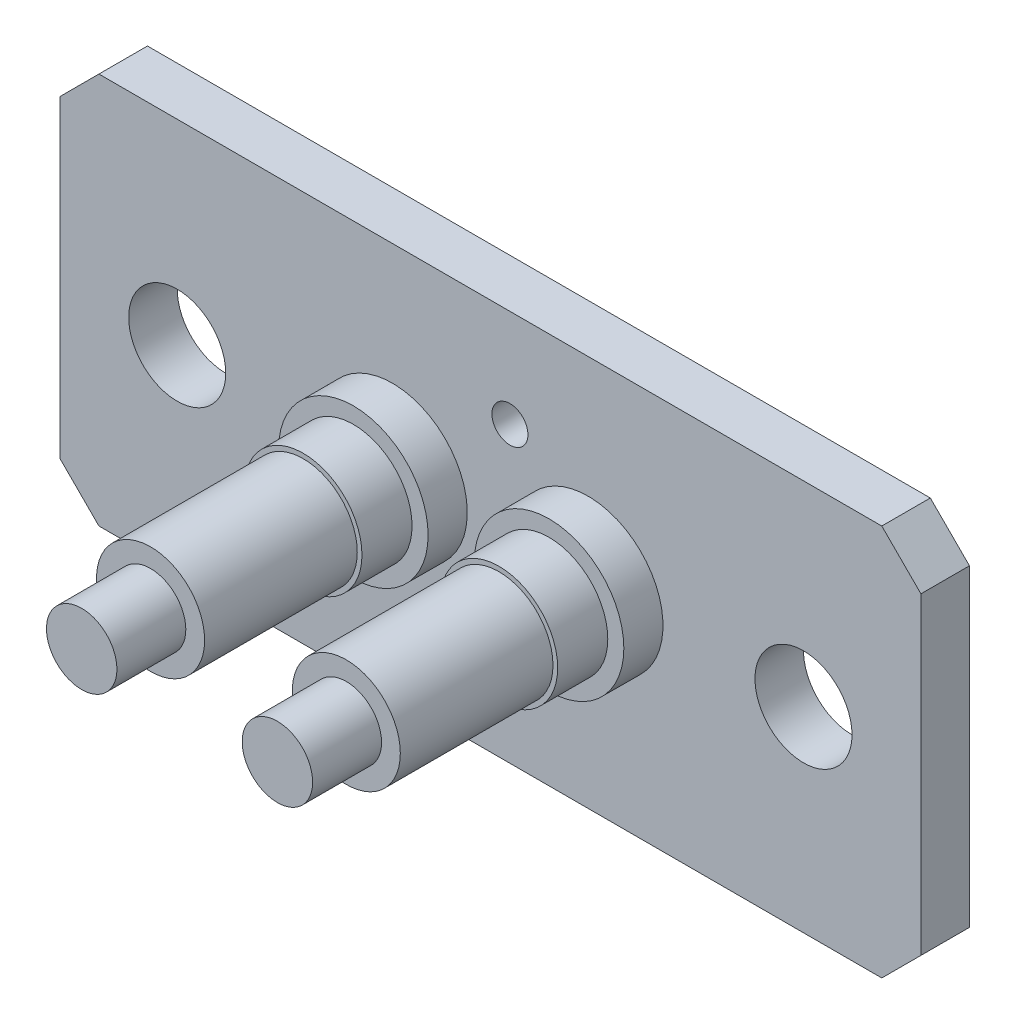
ISO-10303-21;
HEADER;
FILE_DESCRIPTION(('STEP AP214'),'2;1');
FILE_NAME('part.step','',(''),(''),'','','');
FILE_SCHEMA(('AUTOMOTIVE_DESIGN { 1 0 10303 214 1 1 1 1 }'));
ENDSEC;
DATA;
#1=APPLICATION_CONTEXT('core data for automotive mechanical design processes');
#2=APPLICATION_PROTOCOL_DEFINITION('international standard','automotive_design',2000,#1);
#3=PRODUCT_CONTEXT('',#1,'mechanical');
#4=PRODUCT('Part','Part','',(#3));
#5=PRODUCT_RELATED_PRODUCT_CATEGORY('part','',(#4));
#6=PRODUCT_DEFINITION_FORMATION('','',#4);
#7=PRODUCT_DEFINITION_CONTEXT('part definition',#1,'design');
#8=PRODUCT_DEFINITION('design','',#6,#7);
#9=PRODUCT_DEFINITION_SHAPE('','',#8);
#10=(LENGTH_UNIT() NAMED_UNIT(*) SI_UNIT(.MILLI.,.METRE.));
#11=(NAMED_UNIT(*) PLANE_ANGLE_UNIT() SI_UNIT($,.RADIAN.));
#12=(NAMED_UNIT(*) SI_UNIT($,.STERADIAN.) SOLID_ANGLE_UNIT());
#13=UNCERTAINTY_MEASURE_WITH_UNIT(LENGTH_MEASURE(1.E-05),#10,'distance_accuracy_value','');
#14=(GEOMETRIC_REPRESENTATION_CONTEXT(3) GLOBAL_UNCERTAINTY_ASSIGNED_CONTEXT((#13)) GLOBAL_UNIT_ASSIGNED_CONTEXT((#10,
#11,#12)) REPRESENTATION_CONTEXT('',''));
#15=CARTESIAN_POINT('',(0.,0.,0.));
#16=DIRECTION('',(0.,0.,1.));
#17=DIRECTION('',(1.,0.,0.));
#18=AXIS2_PLACEMENT_3D('',#15,#16,#17);
#19=CARTESIAN_POINT('',(0.,0.,1.5748));
#20=DIRECTION('',(0.,0.,-1.));
#21=DIRECTION('',(-1.,0.,0.));
#22=AXIS2_PLACEMENT_3D('',#19,#20,#21);
#23=PLANE('',#22);
#24=CARTESIAN_POINT('',(17.145,6.35,1.5748));
#25=DIRECTION('',(0.,0.,-1.));
#26=DIRECTION('',(-1.,0.,0.));
#27=AXIS2_PLACEMENT_3D('',#24,#25,#26);
#28=CIRCLE('',#27,2.4257);
#29=CARTESIAN_POINT('',(14.7193,6.35,1.5748));
#30=VERTEX_POINT('',#29);
#31=EDGE_CURVE('E163',#30,#30,#28,.F.);
#32=ORIENTED_EDGE('',*,*,#31,.F.);
#33=EDGE_LOOP('',(#32));
#34=FACE_BOUND('',#33,.T.);
#35=CARTESIAN_POINT('',(10.795,6.35,1.5748));
#36=DIRECTION('',(0.,0.,-1.));
#37=DIRECTION('',(-1.,0.,0.));
#38=AXIS2_PLACEMENT_3D('',#35,#36,#37);
#39=CIRCLE('',#38,2.4257);
#40=CARTESIAN_POINT('',(8.3693,6.35,1.5748));
#41=VERTEX_POINT('',#40);
#42=EDGE_CURVE('E160',#41,#41,#39,.F.);
#43=ORIENTED_EDGE('',*,*,#42,.F.);
#44=EDGE_LOOP('',(#43));
#45=FACE_BOUND('',#44,.T.);
#46=DIRECTION('',(0.,-1.,0.));
#47=VECTOR('',#46,1.);
#48=CARTESIAN_POINT('',(0.,1.27,1.5748));
#49=LINE('',#48,#47);
#50=CARTESIAN_POINT('',(0.,11.43,1.5748));
#51=VERTEX_POINT('',#50);
#52=CARTESIAN_POINT('',(0.,1.27,1.5748));
#53=VERTEX_POINT('',#52);
#54=EDGE_CURVE('E145',#51,#53,#49,.T.);
#55=ORIENTED_EDGE('',*,*,#54,.T.);
#56=DIRECTION('',(0.707106781186548,-0.707106781186548,0.));
#57=VECTOR('',#56,1.);
#58=CARTESIAN_POINT('',(1.27,0.,1.5748));
#59=LINE('',#58,#57);
#60=CARTESIAN_POINT('',(1.27,0.,1.5748));
#61=VERTEX_POINT('',#60);
#62=EDGE_CURVE('E93',#53,#61,#59,.T.);
#63=ORIENTED_EDGE('',*,*,#62,.T.);
#64=DIRECTION('',(1.,0.,0.));
#65=VECTOR('',#64,1.);
#66=CARTESIAN_POINT('',(26.67,0.,1.5748));
#67=LINE('',#66,#65);
#68=CARTESIAN_POINT('',(26.67,0.,1.5748));
#69=VERTEX_POINT('',#68);
#70=EDGE_CURVE('E247',#61,#69,#67,.T.);
#71=ORIENTED_EDGE('',*,*,#70,.T.);
#72=DIRECTION('',(0.707106781186548,0.707106781186547,0.));
#73=VECTOR('',#72,1.);
#74=CARTESIAN_POINT('',(27.94,1.27,1.5748));
#75=LINE('',#74,#73);
#76=CARTESIAN_POINT('',(27.94,1.27,1.5748));
#77=VERTEX_POINT('',#76);
#78=EDGE_CURVE('E249',#69,#77,#75,.T.);
#79=ORIENTED_EDGE('',*,*,#78,.T.);
#80=DIRECTION('',(0.,1.,0.));
#81=VECTOR('',#80,1.);
#82=CARTESIAN_POINT('',(27.94,11.43,1.5748));
#83=LINE('',#82,#81);
#84=CARTESIAN_POINT('',(27.94,11.43,1.5748));
#85=VERTEX_POINT('',#84);
#86=EDGE_CURVE('E112',#77,#85,#83,.T.);
#87=ORIENTED_EDGE('',*,*,#86,.T.);
#88=DIRECTION('',(-0.707106781186547,0.707106781186548,0.));
#89=VECTOR('',#88,1.);
#90=CARTESIAN_POINT('',(26.67,12.7,1.5748));
#91=LINE('',#90,#89);
#92=CARTESIAN_POINT('',(26.67,12.7,1.5748));
#93=VERTEX_POINT('',#92);
#94=EDGE_CURVE('E106',#85,#93,#91,.T.);
#95=ORIENTED_EDGE('',*,*,#94,.T.);
#96=DIRECTION('',(-1.,0.,0.));
#97=VECTOR('',#96,1.);
#98=CARTESIAN_POINT('',(1.27,12.7,1.5748));
#99=LINE('',#98,#97);
#100=CARTESIAN_POINT('',(1.27,12.7,1.5748));
#101=VERTEX_POINT('',#100);
#102=EDGE_CURVE('E110',#93,#101,#99,.T.);
#103=ORIENTED_EDGE('',*,*,#102,.T.);
#104=DIRECTION('',(-0.707106781186547,-0.707106781186548,0.));
#105=VECTOR('',#104,1.);
#106=CARTESIAN_POINT('',(0.,11.43,1.5748));
#107=LINE('',#106,#105);
#108=EDGE_CURVE('E49',#101,#51,#107,.T.);
#109=ORIENTED_EDGE('',*,*,#108,.T.);
#110=EDGE_LOOP('',(#55,#63,#71,#79,#87,#95,#103,#109));
#111=FACE_BOUND('',#110,.T.);
#112=CARTESIAN_POINT('',(3.81,6.35,1.5748));
#113=DIRECTION('',(0.,0.,1.));
#114=DIRECTION('',(1.,0.,0.));
#115=AXIS2_PLACEMENT_3D('',#112,#113,#114);
#116=CIRCLE('',#115,1.5748);
#117=CARTESIAN_POINT('',(5.3848,6.35,1.5748));
#118=VERTEX_POINT('',#117);
#119=EDGE_CURVE('E235',#118,#118,#116,.T.);
#120=ORIENTED_EDGE('',*,*,#119,.F.);
#121=EDGE_LOOP('',(#120));
#122=FACE_BOUND('',#121,.T.);
#123=CARTESIAN_POINT('',(24.13,6.35,1.5748));
#124=DIRECTION('',(0.,0.,1.));
#125=DIRECTION('',(1.,0.,0.));
#126=AXIS2_PLACEMENT_3D('',#123,#124,#125);
#127=CIRCLE('',#126,1.5748);
#128=CARTESIAN_POINT('',(25.7048,6.35,1.5748));
#129=VERTEX_POINT('',#128);
#130=EDGE_CURVE('E229',#129,#129,#127,.T.);
#131=ORIENTED_EDGE('',*,*,#130,.F.);
#132=EDGE_LOOP('',(#131));
#133=FACE_BOUND('',#132,.T.);
#134=CARTESIAN_POINT('',(13.335,3.175,1.5748));
#135=DIRECTION('',(0.,0.,1.));
#136=DIRECTION('',(1.,0.,0.));
#137=AXIS2_PLACEMENT_3D('',#134,#135,#136);
#138=CIRCLE('',#137,0.5842);
#139=CARTESIAN_POINT('',(13.9192,3.175,1.5748));
#140=VERTEX_POINT('',#139);
#141=EDGE_CURVE('E223',#140,#140,#138,.T.);
#142=ORIENTED_EDGE('',*,*,#141,.F.);
#143=EDGE_LOOP('',(#142));
#144=FACE_BOUND('',#143,.T.);
#145=CARTESIAN_POINT('',(14.605,9.525,1.5748));
#146=DIRECTION('',(0.,0.,1.));
#147=DIRECTION('',(1.,0.,0.));
#148=AXIS2_PLACEMENT_3D('',#145,#146,#147);
#149=CIRCLE('',#148,0.5842);
#150=CARTESIAN_POINT('',(15.1892,9.525,1.5748));
#151=VERTEX_POINT('',#150);
#152=EDGE_CURVE('E217',#151,#151,#149,.T.);
#153=ORIENTED_EDGE('',*,*,#152,.F.);
#154=EDGE_LOOP('',(#153));
#155=FACE_BOUND('',#154,.T.);
#156=ADVANCED_FACE('F32',(#34,#45,#111,#122,#133,#144,#155),#23,.F.);
#157=CARTESIAN_POINT('',(0.,0.,0.));
#158=DIRECTION('',(0.,0.,-1.));
#159=DIRECTION('',(-1.,0.,0.));
#160=AXIS2_PLACEMENT_3D('',#157,#158,#159);
#161=PLANE('',#160);
#162=CARTESIAN_POINT('',(13.335,3.175,0.));
#163=DIRECTION('',(0.,0.,1.));
#164=DIRECTION('',(1.,0.,0.));
#165=AXIS2_PLACEMENT_3D('',#162,#163,#164);
#166=CIRCLE('',#165,0.5842);
#167=CARTESIAN_POINT('',(13.9192,3.175,0.));
#168=VERTEX_POINT('',#167);
#169=EDGE_CURVE('E220',#168,#168,#166,.T.);
#170=ORIENTED_EDGE('',*,*,#169,.T.);
#171=EDGE_LOOP('',(#170));
#172=FACE_BOUND('',#171,.T.);
#173=CARTESIAN_POINT('',(3.81,6.35,0.));
#174=DIRECTION('',(0.,0.,1.));
#175=DIRECTION('',(1.,0.,0.));
#176=AXIS2_PLACEMENT_3D('',#173,#174,#175);
#177=CIRCLE('',#176,1.5748);
#178=CARTESIAN_POINT('',(5.3848,6.35,0.));
#179=VERTEX_POINT('',#178);
#180=EDGE_CURVE('E232',#179,#179,#177,.T.);
#181=ORIENTED_EDGE('',*,*,#180,.T.);
#182=EDGE_LOOP('',(#181));
#183=FACE_BOUND('',#182,.T.);
#184=CARTESIAN_POINT('',(10.795,6.35,0.));
#185=DIRECTION('',(0.,0.,1.));
#186=DIRECTION('',(1.,0.,0.));
#187=AXIS2_PLACEMENT_3D('',#184,#185,#186);
#188=CIRCLE('',#187,0.5842);
#189=CARTESIAN_POINT('',(11.3792,6.35,0.));
#190=VERTEX_POINT('',#189);
#191=EDGE_CURVE('E134',#190,#190,#188,.T.);
#192=ORIENTED_EDGE('',*,*,#191,.T.);
#193=EDGE_LOOP('',(#192));
#194=FACE_BOUND('',#193,.T.);
#195=DIRECTION('',(0.,-1.,0.));
#196=VECTOR('',#195,1.);
#197=CARTESIAN_POINT('',(0.,1.27,0.));
#198=LINE('',#197,#196);
#199=CARTESIAN_POINT('',(0.,11.43,0.));
#200=VERTEX_POINT('',#199);
#201=CARTESIAN_POINT('',(0.,1.27,0.));
#202=VERTEX_POINT('',#201);
#203=EDGE_CURVE('E130',#200,#202,#198,.T.);
#204=ORIENTED_EDGE('',*,*,#203,.F.);
#205=DIRECTION('',(-0.707106781186547,-0.707106781186548,0.));
#206=VECTOR('',#205,1.);
#207=CARTESIAN_POINT('',(0.,11.43,0.));
#208=LINE('',#207,#206);
#209=CARTESIAN_POINT('',(1.27,12.7,0.));
#210=VERTEX_POINT('',#209);
#211=EDGE_CURVE('E84',#210,#200,#208,.T.);
#212=ORIENTED_EDGE('',*,*,#211,.F.);
#213=DIRECTION('',(-1.,0.,0.));
#214=VECTOR('',#213,1.);
#215=CARTESIAN_POINT('',(1.27,12.7,0.));
#216=LINE('',#215,#214);
#217=CARTESIAN_POINT('',(26.67,12.7,0.));
#218=VERTEX_POINT('',#217);
#219=EDGE_CURVE('E78',#218,#210,#216,.T.);
#220=ORIENTED_EDGE('',*,*,#219,.F.);
#221=DIRECTION('',(-0.707106781186547,0.707106781186548,0.));
#222=VECTOR('',#221,1.);
#223=CARTESIAN_POINT('',(26.67,12.7,0.));
#224=LINE('',#223,#222);
#225=CARTESIAN_POINT('',(27.94,11.43,0.));
#226=VERTEX_POINT('',#225);
#227=EDGE_CURVE('E120',#226,#218,#224,.T.);
#228=ORIENTED_EDGE('',*,*,#227,.F.);
#229=DIRECTION('',(0.,1.,0.));
#230=VECTOR('',#229,1.);
#231=CARTESIAN_POINT('',(27.94,11.43,0.));
#232=LINE('',#231,#230);
#233=CARTESIAN_POINT('',(27.94,1.27,0.));
#234=VERTEX_POINT('',#233);
#235=EDGE_CURVE('E140',#234,#226,#232,.T.);
#236=ORIENTED_EDGE('',*,*,#235,.F.);
#237=DIRECTION('',(0.707106781186548,0.707106781186547,0.));
#238=VECTOR('',#237,1.);
#239=CARTESIAN_POINT('',(27.94,1.27,0.));
#240=LINE('',#239,#238);
#241=CARTESIAN_POINT('',(26.67,0.,0.));
#242=VERTEX_POINT('',#241);
#243=EDGE_CURVE('E138',#242,#234,#240,.T.);
#244=ORIENTED_EDGE('',*,*,#243,.F.);
#245=DIRECTION('',(1.,0.,0.));
#246=VECTOR('',#245,1.);
#247=CARTESIAN_POINT('',(26.67,0.,0.));
#248=LINE('',#247,#246);
#249=CARTESIAN_POINT('',(1.27,0.,0.));
#250=VERTEX_POINT('',#249);
#251=EDGE_CURVE('E136',#250,#242,#248,.T.);
#252=ORIENTED_EDGE('',*,*,#251,.F.);
#253=DIRECTION('',(0.707106781186548,-0.707106781186548,0.));
#254=VECTOR('',#253,1.);
#255=CARTESIAN_POINT('',(1.27,0.,0.));
#256=LINE('',#255,#254);
#257=EDGE_CURVE('E133',#202,#250,#256,.T.);
#258=ORIENTED_EDGE('',*,*,#257,.F.);
#259=EDGE_LOOP('',(#204,#212,#220,#228,#236,#244,#252,#258));
#260=FACE_BOUND('',#259,.T.);
#261=CARTESIAN_POINT('',(17.145,6.35,0.));
#262=DIRECTION('',(0.,0.,1.));
#263=DIRECTION('',(1.,0.,0.));
#264=AXIS2_PLACEMENT_3D('',#261,#262,#263);
#265=CIRCLE('',#264,0.5842);
#266=CARTESIAN_POINT('',(17.7292,6.35,0.));
#267=VERTEX_POINT('',#266);
#268=EDGE_CURVE('E238',#267,#267,#265,.T.);
#269=ORIENTED_EDGE('',*,*,#268,.T.);
#270=EDGE_LOOP('',(#269));
#271=FACE_BOUND('',#270,.T.);
#272=CARTESIAN_POINT('',(24.13,6.35,0.));
#273=DIRECTION('',(0.,0.,1.));
#274=DIRECTION('',(1.,0.,0.));
#275=AXIS2_PLACEMENT_3D('',#272,#273,#274);
#276=CIRCLE('',#275,1.5748);
#277=CARTESIAN_POINT('',(25.7048,6.35,0.));
#278=VERTEX_POINT('',#277);
#279=EDGE_CURVE('E226',#278,#278,#276,.T.);
#280=ORIENTED_EDGE('',*,*,#279,.T.);
#281=EDGE_LOOP('',(#280));
#282=FACE_BOUND('',#281,.T.);
#283=CARTESIAN_POINT('',(14.605,9.525,0.));
#284=DIRECTION('',(0.,0.,1.));
#285=DIRECTION('',(1.,0.,0.));
#286=AXIS2_PLACEMENT_3D('',#283,#284,#285);
#287=CIRCLE('',#286,0.5842);
#288=CARTESIAN_POINT('',(15.1892,9.525,0.));
#289=VERTEX_POINT('',#288);
#290=EDGE_CURVE('E216',#289,#289,#287,.T.);
#291=ORIENTED_EDGE('',*,*,#290,.T.);
#292=EDGE_LOOP('',(#291));
#293=FACE_BOUND('',#292,.T.);
#294=ADVANCED_FACE('F262',(#172,#183,#194,#260,#271,#282,#293),#161,.T.);
#295=CARTESIAN_POINT('',(0.,1.27,1.5748));
#296=DIRECTION('',(1.,0.,0.));
#297=DIRECTION('',(0.,0.,-1.));
#298=AXIS2_PLACEMENT_3D('',#295,#296,#297);
#299=PLANE('',#298);
#300=ORIENTED_EDGE('',*,*,#203,.T.);
#301=DIRECTION('',(0.,0.,-1.));
#302=VECTOR('',#301,1.);
#303=CARTESIAN_POINT('',(0.,1.27,1.5748));
#304=LINE('',#303,#302);
#305=EDGE_CURVE('E158',#53,#202,#304,.T.);
#306=ORIENTED_EDGE('',*,*,#305,.F.);
#307=ORIENTED_EDGE('',*,*,#54,.F.);
#308=DIRECTION('',(0.,0.,-1.));
#309=VECTOR('',#308,1.);
#310=CARTESIAN_POINT('',(0.,11.43,1.5748));
#311=LINE('',#310,#309);
#312=EDGE_CURVE('E126',#51,#200,#311,.T.);
#313=ORIENTED_EDGE('',*,*,#312,.T.);
#314=EDGE_LOOP('',(#300,#306,#307,#313));
#315=FACE_BOUND('',#314,.T.);
#316=ADVANCED_FACE('F34',(#315),#299,.F.);
#317=CARTESIAN_POINT('',(1.27,0.,1.5748));
#318=DIRECTION('',(0.707106781186548,0.707106781186548,0.));
#319=DIRECTION('',(-0.707106781186548,0.707106781186548,0.));
#320=AXIS2_PLACEMENT_3D('',#317,#318,#319);
#321=PLANE('',#320);
#322=ORIENTED_EDGE('',*,*,#257,.T.);
#323=DIRECTION('',(0.,0.,-1.));
#324=VECTOR('',#323,1.);
#325=CARTESIAN_POINT('',(1.27,0.,1.5748));
#326=LINE('',#325,#324);
#327=EDGE_CURVE('E155',#61,#250,#326,.T.);
#328=ORIENTED_EDGE('',*,*,#327,.F.);
#329=ORIENTED_EDGE('',*,*,#62,.F.);
#330=ORIENTED_EDGE('',*,*,#305,.T.);
#331=EDGE_LOOP('',(#322,#328,#329,#330));
#332=FACE_BOUND('',#331,.T.);
#333=ADVANCED_FACE('F585',(#332),#321,.F.);
#334=CARTESIAN_POINT('',(26.67,0.,1.5748));
#335=DIRECTION('',(0.,1.,0.));
#336=DIRECTION('',(0.,0.,1.));
#337=AXIS2_PLACEMENT_3D('',#334,#335,#336);
#338=PLANE('',#337);
#339=ORIENTED_EDGE('',*,*,#251,.T.);
#340=DIRECTION('',(0.,0.,-1.));
#341=VECTOR('',#340,1.);
#342=CARTESIAN_POINT('',(26.67,0.,1.5748));
#343=LINE('',#342,#341);
#344=EDGE_CURVE('E152',#69,#242,#343,.T.);
#345=ORIENTED_EDGE('',*,*,#344,.F.);
#346=ORIENTED_EDGE('',*,*,#70,.F.);
#347=ORIENTED_EDGE('',*,*,#327,.T.);
#348=EDGE_LOOP('',(#339,#345,#346,#347));
#349=FACE_BOUND('',#348,.T.);
#350=ADVANCED_FACE('F576',(#349),#338,.F.);
#351=CARTESIAN_POINT('',(27.94,1.27,1.5748));
#352=DIRECTION('',(-0.707106781186548,0.707106781186548,0.));
#353=DIRECTION('',(-0.707106781186548,-0.707106781186548,0.));
#354=AXIS2_PLACEMENT_3D('',#351,#352,#353);
#355=PLANE('',#354);
#356=ORIENTED_EDGE('',*,*,#243,.T.);
#357=DIRECTION('',(0.,0.,-1.));
#358=VECTOR('',#357,1.);
#359=CARTESIAN_POINT('',(27.94,1.27,1.5748));
#360=LINE('',#359,#358);
#361=EDGE_CURVE('E149',#77,#234,#360,.T.);
#362=ORIENTED_EDGE('',*,*,#361,.F.);
#363=ORIENTED_EDGE('',*,*,#78,.F.);
#364=ORIENTED_EDGE('',*,*,#344,.T.);
#365=EDGE_LOOP('',(#356,#362,#363,#364));
#366=FACE_BOUND('',#365,.T.);
#367=ADVANCED_FACE('F255',(#366),#355,.F.);
#368=CARTESIAN_POINT('',(27.94,11.43,1.5748));
#369=DIRECTION('',(-1.,0.,0.));
#370=DIRECTION('',(0.,0.,1.));
#371=AXIS2_PLACEMENT_3D('',#368,#369,#370);
#372=PLANE('',#371);
#373=ORIENTED_EDGE('',*,*,#235,.T.);
#374=DIRECTION('',(0.,0.,-1.));
#375=VECTOR('',#374,1.);
#376=CARTESIAN_POINT('',(27.94,11.43,1.5748));
#377=LINE('',#376,#375);
#378=EDGE_CURVE('E121',#85,#226,#377,.T.);
#379=ORIENTED_EDGE('',*,*,#378,.F.);
#380=ORIENTED_EDGE('',*,*,#86,.F.);
#381=ORIENTED_EDGE('',*,*,#361,.T.);
#382=EDGE_LOOP('',(#373,#379,#380,#381));
#383=FACE_BOUND('',#382,.T.);
#384=ADVANCED_FACE('F259',(#383),#372,.F.);
#385=CARTESIAN_POINT('',(26.67,12.7,1.5748));
#386=DIRECTION('',(-0.707106781186548,-0.707106781186547,0.));
#387=DIRECTION('',(0.707106781186547,-0.707106781186548,0.));
#388=AXIS2_PLACEMENT_3D('',#385,#386,#387);
#389=PLANE('',#388);
#390=ORIENTED_EDGE('',*,*,#227,.T.);
#391=DIRECTION('',(0.,0.,-1.));
#392=VECTOR('',#391,1.);
#393=CARTESIAN_POINT('',(26.67,12.7,1.5748));
#394=LINE('',#393,#392);
#395=EDGE_CURVE('E117',#93,#218,#394,.T.);
#396=ORIENTED_EDGE('',*,*,#395,.F.);
#397=ORIENTED_EDGE('',*,*,#94,.F.);
#398=ORIENTED_EDGE('',*,*,#378,.T.);
#399=EDGE_LOOP('',(#390,#396,#397,#398));
#400=FACE_BOUND('',#399,.T.);
#401=ADVANCED_FACE('F118',(#400),#389,.F.);
#402=CARTESIAN_POINT('',(1.27,12.7,1.5748));
#403=DIRECTION('',(0.,-1.,0.));
#404=DIRECTION('',(0.,0.,-1.));
#405=AXIS2_PLACEMENT_3D('',#402,#403,#404);
#406=PLANE('',#405);
#407=ORIENTED_EDGE('',*,*,#219,.T.);
#408=DIRECTION('',(0.,0.,-1.));
#409=VECTOR('',#408,1.);
#410=CARTESIAN_POINT('',(1.27,12.7,1.5748));
#411=LINE('',#410,#409);
#412=EDGE_CURVE('E122',#101,#210,#411,.T.);
#413=ORIENTED_EDGE('',*,*,#412,.F.);
#414=ORIENTED_EDGE('',*,*,#102,.F.);
#415=ORIENTED_EDGE('',*,*,#395,.T.);
#416=EDGE_LOOP('',(#407,#413,#414,#415));
#417=FACE_BOUND('',#416,.T.);
#418=ADVANCED_FACE('F124',(#417),#406,.F.);
#419=CARTESIAN_POINT('',(0.,11.43,1.5748));
#420=DIRECTION('',(0.707106781186548,-0.707106781186547,0.));
#421=DIRECTION('',(0.707106781186547,0.707106781186548,0.));
#422=AXIS2_PLACEMENT_3D('',#419,#420,#421);
#423=PLANE('',#422);
#424=ORIENTED_EDGE('',*,*,#211,.T.);
#425=ORIENTED_EDGE('',*,*,#312,.F.);
#426=ORIENTED_EDGE('',*,*,#108,.F.);
#427=ORIENTED_EDGE('',*,*,#412,.T.);
#428=EDGE_LOOP('',(#424,#425,#426,#427));
#429=FACE_BOUND('',#428,.T.);
#430=ADVANCED_FACE('F268',(#429),#423,.F.);
#431=CARTESIAN_POINT('',(10.795,6.35,1.5748));
#432=DIRECTION('',(0.,0.,-1.));
#433=DIRECTION('',(-1.,0.,0.));
#434=AXIS2_PLACEMENT_3D('',#431,#432,#433);
#435=CYLINDRICAL_SURFACE('',#434,0.5842);
#436=CARTESIAN_POINT('',(10.795,6.35,1.5748));
#437=DIRECTION('',(0.,0.,1.));
#438=DIRECTION('',(1.,0.,0.));
#439=AXIS2_PLACEMENT_3D('',#436,#437,#438);
#440=CIRCLE('',#439,0.5842);
#441=CARTESIAN_POINT('',(11.3792,6.35,1.5748));
#442=VERTEX_POINT('',#441);
#443=EDGE_CURVE('E208',#442,#442,#440,.T.);
#444=ORIENTED_EDGE('',*,*,#443,.T.);
#445=EDGE_LOOP('',(#444));
#446=FACE_BOUND('',#445,.T.);
#447=ORIENTED_EDGE('',*,*,#191,.F.);
#448=EDGE_LOOP('',(#447));
#449=FACE_BOUND('',#448,.T.);
#450=ADVANCED_FACE('F270',(#446,#449),#435,.F.);
#451=CARTESIAN_POINT('',(17.145,6.35,1.5748));
#452=DIRECTION('',(0.,0.,-1.));
#453=DIRECTION('',(-1.,0.,0.));
#454=AXIS2_PLACEMENT_3D('',#451,#452,#453);
#455=CYLINDRICAL_SURFACE('',#454,0.5842);
#456=CARTESIAN_POINT('',(17.145,6.35,1.5748));
#457=DIRECTION('',(0.,0.,1.));
#458=DIRECTION('',(1.,0.,0.));
#459=AXIS2_PLACEMENT_3D('',#456,#457,#458);
#460=CIRCLE('',#459,0.5842);
#461=CARTESIAN_POINT('',(17.7292,6.35,1.5748));
#462=VERTEX_POINT('',#461);
#463=EDGE_CURVE('E203',#462,#462,#460,.T.);
#464=ORIENTED_EDGE('',*,*,#463,.T.);
#465=EDGE_LOOP('',(#464));
#466=FACE_BOUND('',#465,.T.);
#467=ORIENTED_EDGE('',*,*,#268,.F.);
#468=EDGE_LOOP('',(#467));
#469=FACE_BOUND('',#468,.T.);
#470=ADVANCED_FACE('F276',(#466,#469),#455,.F.);
#471=CARTESIAN_POINT('',(3.81,6.35,1.5748));
#472=DIRECTION('',(0.,0.,-1.));
#473=DIRECTION('',(-1.,0.,0.));
#474=AXIS2_PLACEMENT_3D('',#471,#472,#473);
#475=CYLINDRICAL_SURFACE('',#474,1.5748);
#476=ORIENTED_EDGE('',*,*,#119,.T.);
#477=EDGE_LOOP('',(#476));
#478=FACE_BOUND('',#477,.T.);
#479=ORIENTED_EDGE('',*,*,#180,.F.);
#480=EDGE_LOOP('',(#479));
#481=FACE_BOUND('',#480,.T.);
#482=ADVANCED_FACE('F293',(#478,#481),#475,.F.);
#483=CARTESIAN_POINT('',(24.13,6.35,1.5748));
#484=DIRECTION('',(0.,0.,-1.));
#485=DIRECTION('',(-1.,0.,0.));
#486=AXIS2_PLACEMENT_3D('',#483,#484,#485);
#487=CYLINDRICAL_SURFACE('',#486,1.5748);
#488=ORIENTED_EDGE('',*,*,#130,.T.);
#489=EDGE_LOOP('',(#488));
#490=FACE_BOUND('',#489,.T.);
#491=ORIENTED_EDGE('',*,*,#279,.F.);
#492=EDGE_LOOP('',(#491));
#493=FACE_BOUND('',#492,.T.);
#494=ADVANCED_FACE('F296',(#490,#493),#487,.F.);
#495=CARTESIAN_POINT('',(13.335,3.175,1.5748));
#496=DIRECTION('',(0.,0.,-1.));
#497=DIRECTION('',(-1.,0.,0.));
#498=AXIS2_PLACEMENT_3D('',#495,#496,#497);
#499=CYLINDRICAL_SURFACE('',#498,0.5842);
#500=ORIENTED_EDGE('',*,*,#141,.T.);
#501=EDGE_LOOP('',(#500));
#502=FACE_BOUND('',#501,.T.);
#503=ORIENTED_EDGE('',*,*,#169,.F.);
#504=EDGE_LOOP('',(#503));
#505=FACE_BOUND('',#504,.T.);
#506=ADVANCED_FACE('F300',(#502,#505),#499,.F.);
#507=CARTESIAN_POINT('',(14.605,9.525,1.5748));
#508=DIRECTION('',(0.,0.,-1.));
#509=DIRECTION('',(-1.,0.,0.));
#510=AXIS2_PLACEMENT_3D('',#507,#508,#509);
#511=CYLINDRICAL_SURFACE('',#510,0.5842);
#512=ORIENTED_EDGE('',*,*,#152,.T.);
#513=EDGE_LOOP('',(#512));
#514=FACE_BOUND('',#513,.T.);
#515=ORIENTED_EDGE('',*,*,#290,.F.);
#516=EDGE_LOOP('',(#515));
#517=FACE_BOUND('',#516,.T.);
#518=ADVANCED_FACE('F304',(#514,#517),#511,.F.);
#519=CARTESIAN_POINT('',(10.795,6.35,1.5748));
#520=DIRECTION('',(0.,0.,1.));
#521=DIRECTION('',(1.,0.,0.));
#522=AXIS2_PLACEMENT_3D('',#519,#520,#521);
#523=PLANE('',#522);
#524=CARTESIAN_POINT('',(10.795,6.35,1.5748));
#525=DIRECTION('',(0.,0.,1.));
#526=DIRECTION('',(1.,0.,0.));
#527=AXIS2_PLACEMENT_3D('',#524,#525,#526);
#528=CIRCLE('',#527,0.508);
#529=CARTESIAN_POINT('',(11.303,6.35,1.5748));
#530=VERTEX_POINT('',#529);
#531=EDGE_CURVE('E11',#530,#530,#528,.F.);
#532=ORIENTED_EDGE('',*,*,#531,.F.);
#533=EDGE_LOOP('',(#532));
#534=FACE_BOUND('',#533,.T.);
#535=ORIENTED_EDGE('',*,*,#443,.F.);
#536=EDGE_LOOP('',(#535));
#537=FACE_BOUND('',#536,.T.);
#538=ADVANCED_FACE('F308',(#534,#537),#523,.F.);
#539=CARTESIAN_POINT('',(10.795,6.35,2.8448));
#540=DIRECTION('',(0.,0.,-1.));
#541=DIRECTION('',(-1.,0.,0.));
#542=AXIS2_PLACEMENT_3D('',#539,#540,#541);
#543=CYLINDRICAL_SURFACE('',#542,2.4257);
#544=CARTESIAN_POINT('',(10.795,6.35,2.8448));
#545=DIRECTION('',(0.,0.,1.));
#546=DIRECTION('',(1.,0.,0.));
#547=AXIS2_PLACEMENT_3D('',#544,#545,#546);
#548=CIRCLE('',#547,2.4257);
#549=CARTESIAN_POINT('',(13.2207,6.35,2.8448));
#550=VERTEX_POINT('',#549);
#551=EDGE_CURVE('E205',#550,#550,#548,.T.);
#552=ORIENTED_EDGE('',*,*,#551,.F.);
#553=EDGE_LOOP('',(#552));
#554=FACE_BOUND('',#553,.T.);
#555=ORIENTED_EDGE('',*,*,#42,.T.);
#556=EDGE_LOOP('',(#555));
#557=FACE_BOUND('',#556,.T.);
#558=ADVANCED_FACE('F310',(#554,#557),#543,.T.);
#559=CARTESIAN_POINT('',(10.795,6.35,2.8448));
#560=DIRECTION('',(0.,0.,1.));
#561=DIRECTION('',(1.,0.,0.));
#562=AXIS2_PLACEMENT_3D('',#559,#560,#561);
#563=PLANE('',#562);
#564=CARTESIAN_POINT('',(10.795,6.35,2.8448));
#565=DIRECTION('',(0.,0.,1.));
#566=DIRECTION('',(1.,0.,0.));
#567=AXIS2_PLACEMENT_3D('',#564,#565,#566);
#568=CIRCLE('',#567,1.905);
#569=CARTESIAN_POINT('',(12.7,6.35,2.8448));
#570=VERTEX_POINT('',#569);
#571=EDGE_CURVE('E166',#570,#570,#568,.F.);
#572=ORIENTED_EDGE('',*,*,#571,.T.);
#573=EDGE_LOOP('',(#572));
#574=FACE_BOUND('',#573,.T.);
#575=ORIENTED_EDGE('',*,*,#551,.T.);
#576=EDGE_LOOP('',(#575));
#577=FACE_BOUND('',#576,.T.);
#578=ADVANCED_FACE('F199',(#574,#577),#563,.T.);
#579=CARTESIAN_POINT('',(17.145,6.35,1.5748));
#580=DIRECTION('',(0.,0.,1.));
#581=DIRECTION('',(1.,0.,0.));
#582=AXIS2_PLACEMENT_3D('',#579,#580,#581);
#583=PLANE('',#582);
#584=CARTESIAN_POINT('',(17.145,6.35,1.5748));
#585=DIRECTION('',(0.,0.,1.));
#586=DIRECTION('',(1.,0.,0.));
#587=AXIS2_PLACEMENT_3D('',#584,#585,#586);
#588=CIRCLE('',#587,0.508000000000002);
#589=CARTESIAN_POINT('',(17.653,6.35,1.5748));
#590=VERTEX_POINT('',#589);
#591=EDGE_CURVE('E41',#590,#590,#588,.F.);
#592=ORIENTED_EDGE('',*,*,#591,.F.);
#593=EDGE_LOOP('',(#592));
#594=FACE_BOUND('',#593,.T.);
#595=ORIENTED_EDGE('',*,*,#463,.F.);
#596=EDGE_LOOP('',(#595));
#597=FACE_BOUND('',#596,.T.);
#598=ADVANCED_FACE('F195',(#594,#597),#583,.F.);
#599=CARTESIAN_POINT('',(17.145,6.35,2.8448));
#600=DIRECTION('',(0.,0.,-1.));
#601=DIRECTION('',(-1.,0.,0.));
#602=AXIS2_PLACEMENT_3D('',#599,#600,#601);
#603=CYLINDRICAL_SURFACE('',#602,2.4257);
#604=CARTESIAN_POINT('',(17.145,6.35,2.8448));
#605=DIRECTION('',(0.,0.,1.));
#606=DIRECTION('',(1.,0.,0.));
#607=AXIS2_PLACEMENT_3D('',#604,#605,#606);
#608=CIRCLE('',#607,2.4257);
#609=CARTESIAN_POINT('',(19.5707,6.35,2.8448));
#610=VERTEX_POINT('',#609);
#611=EDGE_CURVE('E169',#610,#610,#608,.T.);
#612=ORIENTED_EDGE('',*,*,#611,.F.);
#613=EDGE_LOOP('',(#612));
#614=FACE_BOUND('',#613,.T.);
#615=ORIENTED_EDGE('',*,*,#31,.T.);
#616=EDGE_LOOP('',(#615));
#617=FACE_BOUND('',#616,.T.);
#618=ADVANCED_FACE('F198',(#614,#617),#603,.T.);
#619=CARTESIAN_POINT('',(17.145,6.35,2.8448));
#620=DIRECTION('',(0.,0.,1.));
#621=DIRECTION('',(1.,0.,0.));
#622=AXIS2_PLACEMENT_3D('',#619,#620,#621);
#623=PLANE('',#622);
#624=CARTESIAN_POINT('',(17.145,6.35,2.8448));
#625=DIRECTION('',(0.,0.,1.));
#626=DIRECTION('',(1.,0.,0.));
#627=AXIS2_PLACEMENT_3D('',#624,#625,#626);
#628=CIRCLE('',#627,1.905);
#629=CARTESIAN_POINT('',(19.05,6.35,2.8448));
#630=VERTEX_POINT('',#629);
#631=EDGE_CURVE('E171',#630,#630,#628,.F.);
#632=ORIENTED_EDGE('',*,*,#631,.T.);
#633=EDGE_LOOP('',(#632));
#634=FACE_BOUND('',#633,.T.);
#635=ORIENTED_EDGE('',*,*,#611,.T.);
#636=EDGE_LOOP('',(#635));
#637=FACE_BOUND('',#636,.T.);
#638=ADVANCED_FACE('F321',(#634,#637),#623,.T.);
#639=CARTESIAN_POINT('',(10.795,6.35,4.4704));
#640=DIRECTION('',(0.,0.,-1.));
#641=DIRECTION('',(-1.,0.,0.));
#642=AXIS2_PLACEMENT_3D('',#639,#640,#641);
#643=CYLINDRICAL_SURFACE('',#642,1.905);
#644=ORIENTED_EDGE('',*,*,#571,.F.);
#645=EDGE_LOOP('',(#644));
#646=FACE_BOUND('',#645,.T.);
#647=CARTESIAN_POINT('',(10.795,6.35,4.4704));
#648=DIRECTION('',(0.,0.,1.));
#649=DIRECTION('',(1.,0.,0.));
#650=AXIS2_PLACEMENT_3D('',#647,#648,#649);
#651=CIRCLE('',#650,1.905);
#652=CARTESIAN_POINT('',(12.7,6.35,4.4704));
#653=VERTEX_POINT('',#652);
#654=EDGE_CURVE('E170',#653,#653,#651,.T.);
#655=ORIENTED_EDGE('',*,*,#654,.F.);
#656=EDGE_LOOP('',(#655));
#657=FACE_BOUND('',#656,.T.);
#658=ADVANCED_FACE('F326',(#646,#657),#643,.T.);
#659=CARTESIAN_POINT('',(10.795,6.35,4.4704));
#660=DIRECTION('',(0.,0.,1.));
#661=DIRECTION('',(1.,0.,0.));
#662=AXIS2_PLACEMENT_3D('',#659,#660,#661);
#663=PLANE('',#662);
#664=CARTESIAN_POINT('',(10.795,6.35,4.4704));
#665=DIRECTION('',(0.,0.,1.));
#666=DIRECTION('',(1.,0.,0.));
#667=AXIS2_PLACEMENT_3D('',#664,#665,#666);
#668=CIRCLE('',#667,1.7526);
#669=CARTESIAN_POINT('',(12.5476,6.35,4.4704));
#670=VERTEX_POINT('',#669);
#671=EDGE_CURVE('E179',#670,#670,#668,.F.);
#672=ORIENTED_EDGE('',*,*,#671,.T.);
#673=EDGE_LOOP('',(#672));
#674=FACE_BOUND('',#673,.T.);
#675=ORIENTED_EDGE('',*,*,#654,.T.);
#676=EDGE_LOOP('',(#675));
#677=FACE_BOUND('',#676,.T.);
#678=ADVANCED_FACE('F330',(#674,#677),#663,.T.);
#679=CARTESIAN_POINT('',(17.145,6.35,4.4704));
#680=DIRECTION('',(0.,0.,-1.));
#681=DIRECTION('',(-1.,0.,0.));
#682=AXIS2_PLACEMENT_3D('',#679,#680,#681);
#683=CYLINDRICAL_SURFACE('',#682,1.905);
#684=ORIENTED_EDGE('',*,*,#631,.F.);
#685=EDGE_LOOP('',(#684));
#686=FACE_BOUND('',#685,.T.);
#687=CARTESIAN_POINT('',(17.145,6.35,4.4704));
#688=DIRECTION('',(0.,0.,1.));
#689=DIRECTION('',(1.,0.,0.));
#690=AXIS2_PLACEMENT_3D('',#687,#688,#689);
#691=CIRCLE('',#690,1.905);
#692=CARTESIAN_POINT('',(19.05,6.35,4.4704));
#693=VERTEX_POINT('',#692);
#694=EDGE_CURVE('E174',#693,#693,#691,.T.);
#695=ORIENTED_EDGE('',*,*,#694,.F.);
#696=EDGE_LOOP('',(#695));
#697=FACE_BOUND('',#696,.T.);
#698=ADVANCED_FACE('F334',(#686,#697),#683,.T.);
#699=CARTESIAN_POINT('',(17.145,6.35,4.4704));
#700=DIRECTION('',(0.,0.,1.));
#701=DIRECTION('',(1.,0.,0.));
#702=AXIS2_PLACEMENT_3D('',#699,#700,#701);
#703=PLANE('',#702);
#704=CARTESIAN_POINT('',(17.145,6.35,4.4704));
#705=DIRECTION('',(0.,0.,1.));
#706=DIRECTION('',(1.,0.,0.));
#707=AXIS2_PLACEMENT_3D('',#704,#705,#706);
#708=CIRCLE('',#707,1.7526);
#709=CARTESIAN_POINT('',(18.8976,6.35,4.4704));
#710=VERTEX_POINT('',#709);
#711=EDGE_CURVE('E175',#710,#710,#708,.F.);
#712=ORIENTED_EDGE('',*,*,#711,.T.);
#713=EDGE_LOOP('',(#712));
#714=FACE_BOUND('',#713,.T.);
#715=ORIENTED_EDGE('',*,*,#694,.T.);
#716=EDGE_LOOP('',(#715));
#717=FACE_BOUND('',#716,.T.);
#718=ADVANCED_FACE('F338',(#714,#717),#703,.T.);
#719=CARTESIAN_POINT('',(17.145,6.35,9.4234));
#720=DIRECTION('',(0.,0.,-1.));
#721=DIRECTION('',(-1.,0.,0.));
#722=AXIS2_PLACEMENT_3D('',#719,#720,#721);
#723=CYLINDRICAL_SURFACE('',#722,1.7526);
#724=ORIENTED_EDGE('',*,*,#711,.F.);
#725=EDGE_LOOP('',(#724));
#726=FACE_BOUND('',#725,.T.);
#727=CARTESIAN_POINT('',(17.145,6.35,9.4234));
#728=DIRECTION('',(0.,0.,1.));
#729=DIRECTION('',(1.,0.,0.));
#730=AXIS2_PLACEMENT_3D('',#727,#728,#729);
#731=CIRCLE('',#730,1.7526);
#732=CARTESIAN_POINT('',(18.8976,6.35,9.4234));
#733=VERTEX_POINT('',#732);
#734=EDGE_CURVE('E178',#733,#733,#731,.T.);
#735=ORIENTED_EDGE('',*,*,#734,.F.);
#736=EDGE_LOOP('',(#735));
#737=FACE_BOUND('',#736,.T.);
#738=ADVANCED_FACE('F342',(#726,#737),#723,.T.);
#739=CARTESIAN_POINT('',(17.145,6.35,9.4234));
#740=DIRECTION('',(0.,0.,1.));
#741=DIRECTION('',(1.,0.,0.));
#742=AXIS2_PLACEMENT_3D('',#739,#740,#741);
#743=PLANE('',#742);
#744=CARTESIAN_POINT('',(17.145,6.35,9.4234));
#745=DIRECTION('',(0.,0.,1.));
#746=DIRECTION('',(1.,0.,0.));
#747=AXIS2_PLACEMENT_3D('',#744,#745,#746);
#748=CIRCLE('',#747,1.143);
#749=CARTESIAN_POINT('',(18.288,6.35,9.4234));
#750=VERTEX_POINT('',#749);
#751=EDGE_CURVE('E183',#750,#750,#748,.F.);
#752=ORIENTED_EDGE('',*,*,#751,.T.);
#753=EDGE_LOOP('',(#752));
#754=FACE_BOUND('',#753,.T.);
#755=ORIENTED_EDGE('',*,*,#734,.T.);
#756=EDGE_LOOP('',(#755));
#757=FACE_BOUND('',#756,.T.);
#758=ADVANCED_FACE('F346',(#754,#757),#743,.T.);
#759=CARTESIAN_POINT('',(10.795,6.35,9.4234));
#760=DIRECTION('',(0.,0.,-1.));
#761=DIRECTION('',(-1.,0.,0.));
#762=AXIS2_PLACEMENT_3D('',#759,#760,#761);
#763=CYLINDRICAL_SURFACE('',#762,1.7526);
#764=ORIENTED_EDGE('',*,*,#671,.F.);
#765=EDGE_LOOP('',(#764));
#766=FACE_BOUND('',#765,.T.);
#767=CARTESIAN_POINT('',(10.795,6.35,9.4234));
#768=DIRECTION('',(0.,0.,1.));
#769=DIRECTION('',(1.,0.,0.));
#770=AXIS2_PLACEMENT_3D('',#767,#768,#769);
#771=CIRCLE('',#770,1.7526);
#772=CARTESIAN_POINT('',(12.5476,6.35,9.4234));
#773=VERTEX_POINT('',#772);
#774=EDGE_CURVE('E182',#773,#773,#771,.T.);
#775=ORIENTED_EDGE('',*,*,#774,.F.);
#776=EDGE_LOOP('',(#775));
#777=FACE_BOUND('',#776,.T.);
#778=ADVANCED_FACE('F350',(#766,#777),#763,.T.);
#779=CARTESIAN_POINT('',(10.795,6.35,9.4234));
#780=DIRECTION('',(0.,0.,1.));
#781=DIRECTION('',(1.,0.,0.));
#782=AXIS2_PLACEMENT_3D('',#779,#780,#781);
#783=PLANE('',#782);
#784=CARTESIAN_POINT('',(10.795,6.35,9.4234));
#785=DIRECTION('',(0.,0.,1.));
#786=DIRECTION('',(1.,0.,0.));
#787=AXIS2_PLACEMENT_3D('',#784,#785,#786);
#788=CIRCLE('',#787,1.143);
#789=CARTESIAN_POINT('',(11.938,6.35,9.4234));
#790=VERTEX_POINT('',#789);
#791=EDGE_CURVE('E187',#790,#790,#788,.F.);
#792=ORIENTED_EDGE('',*,*,#791,.T.);
#793=EDGE_LOOP('',(#792));
#794=FACE_BOUND('',#793,.T.);
#795=ORIENTED_EDGE('',*,*,#774,.T.);
#796=EDGE_LOOP('',(#795));
#797=FACE_BOUND('',#796,.T.);
#798=ADVANCED_FACE('F354',(#794,#797),#783,.T.);
#799=CARTESIAN_POINT('',(17.145,6.35,11.6586));
#800=DIRECTION('',(0.,0.,-1.));
#801=DIRECTION('',(-1.,0.,0.));
#802=AXIS2_PLACEMENT_3D('',#799,#800,#801);
#803=CYLINDRICAL_SURFACE('',#802,1.143);
#804=ORIENTED_EDGE('',*,*,#751,.F.);
#805=EDGE_LOOP('',(#804));
#806=FACE_BOUND('',#805,.T.);
#807=CARTESIAN_POINT('',(17.145,6.35,11.6586));
#808=DIRECTION('',(0.,0.,1.));
#809=DIRECTION('',(1.,0.,0.));
#810=AXIS2_PLACEMENT_3D('',#807,#808,#809);
#811=CIRCLE('',#810,1.143);
#812=CARTESIAN_POINT('',(18.288,6.35,11.6586));
#813=VERTEX_POINT('',#812);
#814=EDGE_CURVE('E186',#813,#813,#811,.T.);
#815=ORIENTED_EDGE('',*,*,#814,.F.);
#816=EDGE_LOOP('',(#815));
#817=FACE_BOUND('',#816,.T.);
#818=ADVANCED_FACE('F358',(#806,#817),#803,.T.);
#819=CARTESIAN_POINT('',(17.145,6.35,11.6586));
#820=DIRECTION('',(0.,0.,1.));
#821=DIRECTION('',(1.,0.,0.));
#822=AXIS2_PLACEMENT_3D('',#819,#820,#821);
#823=PLANE('',#822);
#824=ORIENTED_EDGE('',*,*,#814,.T.);
#825=EDGE_LOOP('',(#824));
#826=FACE_BOUND('',#825,.T.);
#827=ADVANCED_FACE('F362',(#826),#823,.T.);
#828=CARTESIAN_POINT('',(10.795,6.35,11.6586));
#829=DIRECTION('',(0.,0.,-1.));
#830=DIRECTION('',(-1.,0.,0.));
#831=AXIS2_PLACEMENT_3D('',#828,#829,#830);
#832=CYLINDRICAL_SURFACE('',#831,1.143);
#833=ORIENTED_EDGE('',*,*,#791,.F.);
#834=EDGE_LOOP('',(#833));
#835=FACE_BOUND('',#834,.T.);
#836=CARTESIAN_POINT('',(10.795,6.35,11.6586));
#837=DIRECTION('',(0.,0.,1.));
#838=DIRECTION('',(1.,0.,0.));
#839=AXIS2_PLACEMENT_3D('',#836,#837,#838);
#840=CIRCLE('',#839,1.143);
#841=CARTESIAN_POINT('',(11.938,6.35,11.6586));
#842=VERTEX_POINT('',#841);
#843=EDGE_CURVE('E189',#842,#842,#840,.T.);
#844=ORIENTED_EDGE('',*,*,#843,.F.);
#845=EDGE_LOOP('',(#844));
#846=FACE_BOUND('',#845,.T.);
#847=ADVANCED_FACE('F366',(#835,#846),#832,.T.);
#848=CARTESIAN_POINT('',(10.795,6.35,11.6586));
#849=DIRECTION('',(0.,0.,1.));
#850=DIRECTION('',(1.,0.,0.));
#851=AXIS2_PLACEMENT_3D('',#848,#849,#850);
#852=PLANE('',#851);
#853=ORIENTED_EDGE('',*,*,#843,.T.);
#854=EDGE_LOOP('',(#853));
#855=FACE_BOUND('',#854,.T.);
#856=ADVANCED_FACE('F370',(#855),#852,.T.);
#857=CARTESIAN_POINT('',(17.145,6.35,-1.2192));
#858=DIRECTION('',(0.,0.,1.));
#859=DIRECTION('',(1.,0.,0.));
#860=AXIS2_PLACEMENT_3D('',#857,#858,#859);
#861=CYLINDRICAL_SURFACE('',#860,0.508000000000002);
#862=CARTESIAN_POINT('',(17.145,6.35,-1.2192));
#863=DIRECTION('',(0.,0.,-1.));
#864=DIRECTION('',(-1.,0.,0.));
#865=AXIS2_PLACEMENT_3D('',#862,#863,#864);
#866=CIRCLE('',#865,0.508000000000002);
#867=CARTESIAN_POINT('',(16.637,6.35,-1.2192));
#868=VERTEX_POINT('',#867);
#869=EDGE_CURVE('E394',#868,#868,#866,.T.);
#870=ORIENTED_EDGE('',*,*,#869,.F.);
#871=EDGE_LOOP('',(#870));
#872=FACE_BOUND('',#871,.T.);
#873=ORIENTED_EDGE('',*,*,#591,.T.);
#874=EDGE_LOOP('',(#873));
#875=FACE_BOUND('',#874,.T.);
#876=ADVANCED_FACE('F193',(#872,#875),#861,.T.);
#877=CARTESIAN_POINT('',(17.145,6.35,-1.2192));
#878=DIRECTION('',(0.,0.,-1.));
#879=DIRECTION('',(-1.,0.,0.));
#880=AXIS2_PLACEMENT_3D('',#877,#878,#879);
#881=PLANE('',#880);
#882=ORIENTED_EDGE('',*,*,#869,.T.);
#883=EDGE_LOOP('',(#882));
#884=FACE_BOUND('',#883,.T.);
#885=ADVANCED_FACE('F377',(#884),#881,.T.);
#886=CARTESIAN_POINT('',(10.795,6.35,-1.2192));
#887=DIRECTION('',(0.,0.,1.));
#888=DIRECTION('',(1.,0.,0.));
#889=AXIS2_PLACEMENT_3D('',#886,#887,#888);
#890=CYLINDRICAL_SURFACE('',#889,0.508);
#891=CARTESIAN_POINT('',(10.795,6.35,-1.2192));
#892=DIRECTION('',(0.,0.,-1.));
#893=DIRECTION('',(-1.,0.,0.));
#894=AXIS2_PLACEMENT_3D('',#891,#892,#893);
#895=CIRCLE('',#894,0.508);
#896=CARTESIAN_POINT('',(10.287,6.35,-1.2192));
#897=VERTEX_POINT('',#896);
#898=EDGE_CURVE('E393',#897,#897,#895,.T.);
#899=ORIENTED_EDGE('',*,*,#898,.F.);
#900=EDGE_LOOP('',(#899));
#901=FACE_BOUND('',#900,.T.);
#902=ORIENTED_EDGE('',*,*,#531,.T.);
#903=EDGE_LOOP('',(#902));
#904=FACE_BOUND('',#903,.T.);
#905=ADVANCED_FACE('F381',(#901,#904),#890,.T.);
#906=CARTESIAN_POINT('',(10.795,6.35,-1.2192));
#907=DIRECTION('',(0.,0.,-1.));
#908=DIRECTION('',(-1.,0.,0.));
#909=AXIS2_PLACEMENT_3D('',#906,#907,#908);
#910=PLANE('',#909);
#911=ORIENTED_EDGE('',*,*,#898,.T.);
#912=EDGE_LOOP('',(#911));
#913=FACE_BOUND('',#912,.T.);
#914=ADVANCED_FACE('F385',(#913),#910,.T.);
#915=CLOSED_SHELL('',(#156,#294,#316,#333,#350,#367,#384,#401,#418,#430,#450,#470,#482,#494,
#506,#518,#538,#558,#578,#598,#618,#638,#658,#678,#698,#718,#738,#758,#778,#798,#818,#827,#847,
#856,#876,#885,#905,#914));
#916=MANIFOLD_SOLID_BREP('B2',#915);
#917=ADVANCED_BREP_SHAPE_REPRESENTATION('',(#18,#916),#14);
#918=SHAPE_DEFINITION_REPRESENTATION(#9,#917);
ENDSEC;
END-ISO-10303-21;
